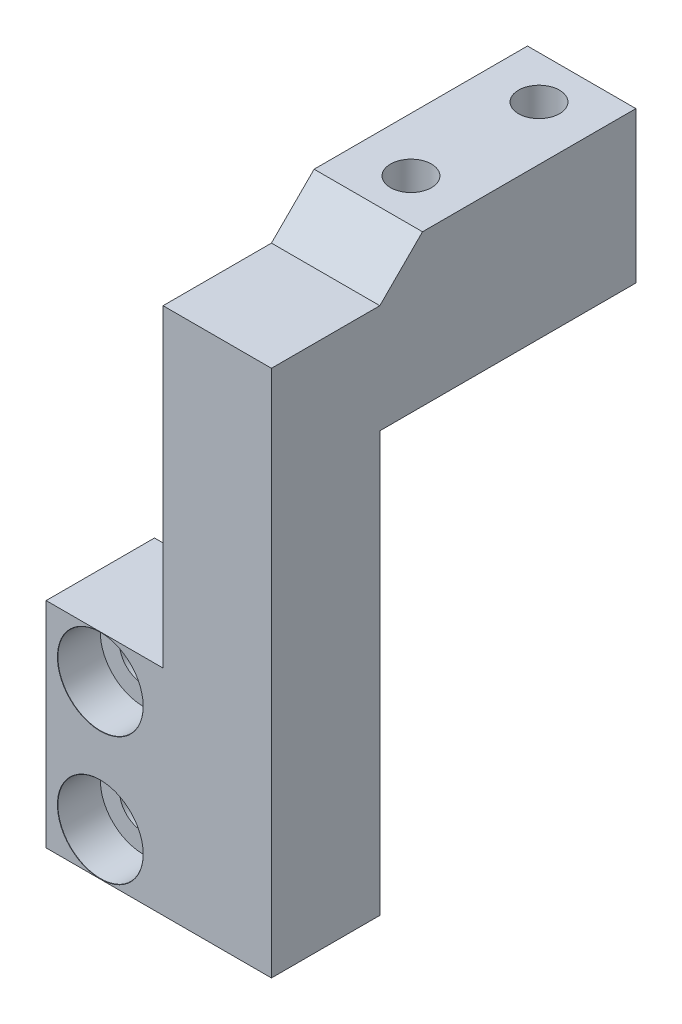
ISO-10303-21;
HEADER;
FILE_DESCRIPTION(('STEP AP214'),'2;1');
FILE_NAME('part.step','',(''),(''),'','','');
FILE_SCHEMA(('AUTOMOTIVE_DESIGN { 1 0 10303 214 1 1 1 1 }'));
ENDSEC;
DATA;
#1=APPLICATION_CONTEXT('core data for automotive mechanical design processes');
#2=APPLICATION_PROTOCOL_DEFINITION('international standard','automotive_design',2000,#1);
#3=PRODUCT_CONTEXT('',#1,'mechanical');
#4=PRODUCT('Part','Part','',(#3));
#5=PRODUCT_RELATED_PRODUCT_CATEGORY('part','',(#4));
#6=PRODUCT_DEFINITION_FORMATION('','',#4);
#7=PRODUCT_DEFINITION_CONTEXT('part definition',#1,'design');
#8=PRODUCT_DEFINITION('design','',#6,#7);
#9=PRODUCT_DEFINITION_SHAPE('','',#8);
#10=(LENGTH_UNIT() NAMED_UNIT(*) SI_UNIT(.MILLI.,.METRE.));
#11=(NAMED_UNIT(*) PLANE_ANGLE_UNIT() SI_UNIT($,.RADIAN.));
#12=(NAMED_UNIT(*) SI_UNIT($,.STERADIAN.) SOLID_ANGLE_UNIT());
#13=UNCERTAINTY_MEASURE_WITH_UNIT(LENGTH_MEASURE(1.E-05),#10,'distance_accuracy_value','');
#14=(GEOMETRIC_REPRESENTATION_CONTEXT(3) GLOBAL_UNCERTAINTY_ASSIGNED_CONTEXT((#13)) GLOBAL_UNIT_ASSIGNED_CONTEXT((#10,
#11,#12)) REPRESENTATION_CONTEXT('',''));
#15=CARTESIAN_POINT('',(0.,0.,0.));
#16=DIRECTION('',(0.,0.,1.));
#17=DIRECTION('',(1.,0.,0.));
#18=AXIS2_PLACEMENT_3D('',#15,#16,#17);
#19=CARTESIAN_POINT('',(0.,12.7,0.));
#20=DIRECTION('',(0.,-1.,0.));
#21=DIRECTION('',(0.,0.,-1.));
#22=AXIS2_PLACEMENT_3D('',#19,#20,#21);
#23=PLANE('',#22);
#24=DIRECTION('',(0.,0.,1.));
#25=VECTOR('',#24,1.);
#26=CARTESIAN_POINT('',(-6.35,12.7,42.));
#27=LINE('',#26,#25);
#28=CARTESIAN_POINT('',(-6.35,12.7,-12.));
#29=VERTEX_POINT('',#28);
#30=CARTESIAN_POINT('',(-6.35,12.7,0.700000000000013));
#31=VERTEX_POINT('',#30);
#32=EDGE_CURVE('E254',#29,#31,#27,.T.);
#33=ORIENTED_EDGE('',*,*,#32,.T.);
#34=DIRECTION('',(1.,0.,0.));
#35=VECTOR('',#34,1.);
#36=CARTESIAN_POINT('',(-6.35,12.7,0.700000000000013));
#37=LINE('',#36,#35);
#38=CARTESIAN_POINT('',(6.35,12.7,0.700000000000013));
#39=VERTEX_POINT('',#38);
#40=EDGE_CURVE('E188',#31,#39,#37,.T.);
#41=ORIENTED_EDGE('',*,*,#40,.T.);
#42=DIRECTION('',(0.,0.,-1.));
#43=VECTOR('',#42,1.);
#44=CARTESIAN_POINT('',(6.35,12.7,42.));
#45=LINE('',#44,#43);
#46=CARTESIAN_POINT('',(6.35,12.7,-12.));
#47=VERTEX_POINT('',#46);
#48=EDGE_CURVE('E251',#39,#47,#45,.T.);
#49=ORIENTED_EDGE('',*,*,#48,.T.);
#50=DIRECTION('',(-1.,0.,0.));
#51=VECTOR('',#50,1.);
#52=CARTESIAN_POINT('',(-6.35,12.7,-12.));
#53=LINE('',#52,#51);
#54=EDGE_CURVE('E275',#47,#29,#53,.T.);
#55=ORIENTED_EDGE('',*,*,#54,.T.);
#56=EDGE_LOOP('',(#33,#41,#49,#55));
#57=FACE_BOUND('',#56,.T.);
#58=ADVANCED_FACE('F45',(#57),#23,.F.);
#59=CARTESIAN_POINT('',(6.35,12.7,42.));
#60=DIRECTION('',(-1.,0.,0.));
#61=DIRECTION('',(0.,0.,1.));
#62=AXIS2_PLACEMENT_3D('',#59,#60,#61);
#63=PLANE('',#62);
#64=ORIENTED_EDGE('',*,*,#48,.F.);
#65=DIRECTION('',(0.,1.,0.));
#66=VECTOR('',#65,1.);
#67=CARTESIAN_POINT('',(6.35,12.7,0.700000000000013));
#68=LINE('',#67,#66);
#69=CARTESIAN_POINT('',(6.35,-49.17,0.700000000000021));
#70=VERTEX_POINT('',#69);
#71=EDGE_CURVE('E184',#70,#39,#68,.T.);
#72=ORIENTED_EDGE('',*,*,#71,.F.);
#73=DIRECTION('',(0.,0.,1.));
#74=VECTOR('',#73,1.);
#75=CARTESIAN_POINT('',(6.35,-49.17,0.700000000000021));
#76=LINE('',#75,#74);
#77=CARTESIAN_POINT('',(6.35,-49.17,-12.));
#78=VERTEX_POINT('',#77);
#79=EDGE_CURVE('E133',#78,#70,#76,.T.);
#80=ORIENTED_EDGE('',*,*,#79,.F.);
#81=DIRECTION('',(0.,1.,0.));
#82=VECTOR('',#81,1.);
#83=CARTESIAN_POINT('',(6.35,-49.17,-12.));
#84=LINE('',#83,#82);
#85=CARTESIAN_POINT('',(6.35,0.,-12.));
#86=VERTEX_POINT('',#85);
#87=EDGE_CURVE('E137',#78,#86,#84,.T.);
#88=ORIENTED_EDGE('',*,*,#87,.T.);
#89=DIRECTION('',(0.,0.,-1.));
#90=VECTOR('',#89,1.);
#91=CARTESIAN_POINT('',(6.35,0.,42.));
#92=LINE('',#91,#90);
#93=CARTESIAN_POINT('',(6.35,0.,-42.));
#94=VERTEX_POINT('',#93);
#95=EDGE_CURVE('E250',#86,#94,#92,.T.);
#96=ORIENTED_EDGE('',*,*,#95,.T.);
#97=DIRECTION('',(0.,-1.,0.));
#98=VECTOR('',#97,1.);
#99=CARTESIAN_POINT('',(6.35,12.7,-42.));
#100=LINE('',#99,#98);
#101=CARTESIAN_POINT('',(6.34999999999994,17.7,-42.));
#102=VERTEX_POINT('',#101);
#103=EDGE_CURVE('E271',#102,#94,#100,.T.);
#104=ORIENTED_EDGE('',*,*,#103,.F.);
#105=DIRECTION('',(0.,0.,-1.));
#106=VECTOR('',#105,1.);
#107=CARTESIAN_POINT('',(6.34999999999994,17.7,-42.));
#108=LINE('',#107,#106);
#109=CARTESIAN_POINT('',(6.35000000000006,17.7,-17.));
#110=VERTEX_POINT('',#109);
#111=EDGE_CURVE('E242',#110,#102,#108,.T.);
#112=ORIENTED_EDGE('',*,*,#111,.F.);
#113=DIRECTION('',(0.,0.70710678118655,-0.707106781186545));
#114=VECTOR('',#113,1.);
#115=CARTESIAN_POINT('',(6.35,-14.3,14.9999999999998));
#116=LINE('',#115,#114);
#117=EDGE_CURVE('E56',#110,#47,#116,.F.);
#118=ORIENTED_EDGE('',*,*,#117,.T.);
#119=EDGE_LOOP('',(#64,#72,#80,#88,#96,#104,#112,#118));
#120=FACE_BOUND('',#119,.T.);
#121=ADVANCED_FACE('F345',(#120),#63,.F.);
#122=CARTESIAN_POINT('',(-6.35,12.7,-42.));
#123=DIRECTION('',(0.,0.,1.));
#124=DIRECTION('',(1.,0.,0.));
#125=AXIS2_PLACEMENT_3D('',#122,#123,#124);
#126=PLANE('',#125);
#127=DIRECTION('',(-1.,0.,0.));
#128=VECTOR('',#127,1.);
#129=CARTESIAN_POINT('',(-6.35,0.,-42.));
#130=LINE('',#129,#128);
#131=CARTESIAN_POINT('',(-6.35,0.,-42.));
#132=VERTEX_POINT('',#131);
#133=EDGE_CURVE('E262',#94,#132,#130,.T.);
#134=ORIENTED_EDGE('',*,*,#133,.T.);
#135=DIRECTION('',(0.,-1.,0.));
#136=VECTOR('',#135,1.);
#137=CARTESIAN_POINT('',(-6.35,12.7,-42.));
#138=LINE('',#137,#136);
#139=CARTESIAN_POINT('',(-6.34999999999994,17.7,-42.));
#140=VERTEX_POINT('',#139);
#141=EDGE_CURVE('E259',#140,#132,#138,.T.);
#142=ORIENTED_EDGE('',*,*,#141,.F.);
#143=DIRECTION('',(-1.,0.,0.));
#144=VECTOR('',#143,1.);
#145=CARTESIAN_POINT('',(-6.34999999999994,17.7,-42.));
#146=LINE('',#145,#144);
#147=EDGE_CURVE('E246',#102,#140,#146,.T.);
#148=ORIENTED_EDGE('',*,*,#147,.F.);
#149=ORIENTED_EDGE('',*,*,#103,.T.);
#150=EDGE_LOOP('',(#134,#142,#148,#149));
#151=FACE_BOUND('',#150,.T.);
#152=ADVANCED_FACE('F351',(#151),#126,.F.);
#153=CARTESIAN_POINT('',(-6.35,12.7,42.));
#154=DIRECTION('',(1.,0.,0.));
#155=DIRECTION('',(0.,0.,-1.));
#156=AXIS2_PLACEMENT_3D('',#153,#154,#155);
#157=PLANE('',#156);
#158=DIRECTION('',(0.,1.,0.));
#159=VECTOR('',#158,1.);
#160=CARTESIAN_POINT('',(-6.35,-49.17,-12.));
#161=LINE('',#160,#159);
#162=CARTESIAN_POINT('',(-6.35,-24.07,-12.));
#163=VERTEX_POINT('',#162);
#164=CARTESIAN_POINT('',(-6.35,0.,-12.));
#165=VERTEX_POINT('',#164);
#166=EDGE_CURVE('E72',#163,#165,#161,.T.);
#167=ORIENTED_EDGE('',*,*,#166,.F.);
#168=DIRECTION('',(0.,0.,1.));
#169=VECTOR('',#168,1.);
#170=CARTESIAN_POINT('',(-6.35,-24.07,0.700000000000021));
#171=LINE('',#170,#169);
#172=CARTESIAN_POINT('',(-6.35,-24.07,0.699999999999993));
#173=VERTEX_POINT('',#172);
#174=EDGE_CURVE('E152',#163,#173,#171,.T.);
#175=ORIENTED_EDGE('',*,*,#174,.T.);
#176=DIRECTION('',(0.,1.,0.));
#177=VECTOR('',#176,1.);
#178=CARTESIAN_POINT('',(-6.35,12.7,0.700000000000013));
#179=LINE('',#178,#177);
#180=EDGE_CURVE('E185',#173,#31,#179,.T.);
#181=ORIENTED_EDGE('',*,*,#180,.T.);
#182=ORIENTED_EDGE('',*,*,#32,.F.);
#183=DIRECTION('',(0.,-0.70710678118655,0.707106781186545));
#184=VECTOR('',#183,1.);
#185=CARTESIAN_POINT('',(-6.35,-14.3,14.9999999999998));
#186=LINE('',#185,#184);
#187=CARTESIAN_POINT('',(-6.34999999999994,17.7,-17.));
#188=VERTEX_POINT('',#187);
#189=EDGE_CURVE('E11',#29,#188,#186,.F.);
#190=ORIENTED_EDGE('',*,*,#189,.T.);
#191=DIRECTION('',(0.,0.,1.));
#192=VECTOR('',#191,1.);
#193=CARTESIAN_POINT('',(-6.34999999999994,17.7,-42.));
#194=LINE('',#193,#192);
#195=EDGE_CURVE('E234',#140,#188,#194,.T.);
#196=ORIENTED_EDGE('',*,*,#195,.F.);
#197=ORIENTED_EDGE('',*,*,#141,.T.);
#198=DIRECTION('',(0.,0.,1.));
#199=VECTOR('',#198,1.);
#200=CARTESIAN_POINT('',(-6.35,0.,42.));
#201=LINE('',#200,#199);
#202=EDGE_CURVE('E255',#132,#165,#201,.T.);
#203=ORIENTED_EDGE('',*,*,#202,.T.);
#204=EDGE_LOOP('',(#167,#175,#181,#182,#190,#196,#197,#203));
#205=FACE_BOUND('',#204,.T.);
#206=ADVANCED_FACE('F360',(#205),#157,.F.);
#207=CARTESIAN_POINT('',(0.,0.,0.));
#208=DIRECTION('',(0.,-1.,0.));
#209=DIRECTION('',(0.,0.,-1.));
#210=AXIS2_PLACEMENT_3D('',#207,#208,#209);
#211=PLANE('',#210);
#212=DIRECTION('',(1.,0.,0.));
#213=VECTOR('',#212,1.);
#214=CARTESIAN_POINT('',(-6.35,0.,-12.));
#215=LINE('',#214,#213);
#216=EDGE_CURVE('E169',#165,#86,#215,.T.);
#217=ORIENTED_EDGE('',*,*,#216,.F.);
#218=ORIENTED_EDGE('',*,*,#202,.F.);
#219=ORIENTED_EDGE('',*,*,#133,.F.);
#220=ORIENTED_EDGE('',*,*,#95,.F.);
#221=EDGE_LOOP('',(#217,#218,#219,#220));
#222=FACE_BOUND('',#221,.T.);
#223=CARTESIAN_POINT('',(0.,0.,-37.));
#224=DIRECTION('',(0.,-1.,0.));
#225=DIRECTION('',(0.,0.,-1.));
#226=AXIS2_PLACEMENT_3D('',#223,#224,#225);
#227=CIRCLE('',#226,4.025);
#228=CARTESIAN_POINT('',(0.,0.,-41.025));
#229=VERTEX_POINT('',#228);
#230=EDGE_CURVE('E194',#229,#229,#227,.T.);
#231=ORIENTED_EDGE('',*,*,#230,.F.);
#232=EDGE_LOOP('',(#231));
#233=FACE_BOUND('',#232,.T.);
#234=CARTESIAN_POINT('',(0.,0.,-22.));
#235=DIRECTION('',(0.,-1.,0.));
#236=DIRECTION('',(0.,0.,-1.));
#237=AXIS2_PLACEMENT_3D('',#234,#235,#236);
#238=CIRCLE('',#237,4.025);
#239=CARTESIAN_POINT('',(0.,0.,-26.025));
#240=VERTEX_POINT('',#239);
#241=EDGE_CURVE('E214',#240,#240,#238,.T.);
#242=ORIENTED_EDGE('',*,*,#241,.F.);
#243=EDGE_LOOP('',(#242));
#244=FACE_BOUND('',#243,.T.);
#245=ADVANCED_FACE('F357',(#222,#233,#244),#211,.T.);
#246=CARTESIAN_POINT('',(0.,17.7,0.));
#247=DIRECTION('',(0.,1.,0.));
#248=DIRECTION('',(0.,0.,1.));
#249=AXIS2_PLACEMENT_3D('',#246,#247,#248);
#250=PLANE('',#249);
#251=CARTESIAN_POINT('',(0.,17.7,-37.));
#252=DIRECTION('',(0.,-1.,0.));
#253=DIRECTION('',(0.,0.,-1.));
#254=AXIS2_PLACEMENT_3D('',#251,#252,#253);
#255=CIRCLE('',#254,2.4);
#256=CARTESIAN_POINT('',(0.,17.7,-39.4));
#257=VERTEX_POINT('',#256);
#258=EDGE_CURVE('E210',#257,#257,#255,.T.);
#259=ORIENTED_EDGE('',*,*,#258,.T.);
#260=EDGE_LOOP('',(#259));
#261=FACE_BOUND('',#260,.T.);
#262=CARTESIAN_POINT('',(0.,17.7,-22.));
#263=DIRECTION('',(0.,-1.,0.));
#264=DIRECTION('',(0.,0.,-1.));
#265=AXIS2_PLACEMENT_3D('',#262,#263,#264);
#266=CIRCLE('',#265,2.4);
#267=CARTESIAN_POINT('',(0.,17.7,-24.4));
#268=VERTEX_POINT('',#267);
#269=EDGE_CURVE('E230',#268,#268,#266,.T.);
#270=ORIENTED_EDGE('',*,*,#269,.T.);
#271=EDGE_LOOP('',(#270));
#272=FACE_BOUND('',#271,.T.);
#273=ORIENTED_EDGE('',*,*,#195,.T.);
#274=DIRECTION('',(1.,0.,0.));
#275=VECTOR('',#274,1.);
#276=CARTESIAN_POINT('',(-6.34999999999994,17.7,-17.));
#277=LINE('',#276,#275);
#278=EDGE_CURVE('E238',#188,#110,#277,.T.);
#279=ORIENTED_EDGE('',*,*,#278,.T.);
#280=ORIENTED_EDGE('',*,*,#111,.T.);
#281=ORIENTED_EDGE('',*,*,#147,.T.);
#282=EDGE_LOOP('',(#273,#279,#280,#281));
#283=FACE_BOUND('',#282,.T.);
#284=ADVANCED_FACE('F355',(#261,#272,#283),#250,.T.);
#285=CARTESIAN_POINT('',(0.,0.,-22.));
#286=DIRECTION('',(0.,-1.,0.));
#287=DIRECTION('',(0.,0.,-1.));
#288=AXIS2_PLACEMENT_3D('',#285,#286,#287);
#289=CYLINDRICAL_SURFACE('',#288,2.4);
#290=ORIENTED_EDGE('',*,*,#269,.F.);
#291=EDGE_LOOP('',(#290));
#292=FACE_BOUND('',#291,.T.);
#293=CARTESIAN_POINT('',(0.,4.,-22.));
#294=DIRECTION('',(0.,-1.,0.));
#295=DIRECTION('',(0.,0.,-1.));
#296=AXIS2_PLACEMENT_3D('',#293,#294,#295);
#297=CIRCLE('',#296,2.4);
#298=CARTESIAN_POINT('',(0.,4.,-24.4));
#299=VERTEX_POINT('',#298);
#300=EDGE_CURVE('E226',#299,#299,#297,.T.);
#301=ORIENTED_EDGE('',*,*,#300,.T.);
#302=EDGE_LOOP('',(#301));
#303=FACE_BOUND('',#302,.T.);
#304=ADVANCED_FACE('F385',(#292,#303),#289,.F.);
#305=CARTESIAN_POINT('',(4.,4.,-22.));
#306=DIRECTION('',(0.,1.,0.));
#307=DIRECTION('',(0.,0.,1.));
#308=AXIS2_PLACEMENT_3D('',#305,#306,#307);
#309=PLANE('',#308);
#310=ORIENTED_EDGE('',*,*,#300,.F.);
#311=EDGE_LOOP('',(#310));
#312=FACE_BOUND('',#311,.T.);
#313=CARTESIAN_POINT('',(0.,4.,-22.));
#314=DIRECTION('',(0.,-1.,0.));
#315=DIRECTION('',(0.,0.,-1.));
#316=AXIS2_PLACEMENT_3D('',#313,#314,#315);
#317=CIRCLE('',#316,4.);
#318=CARTESIAN_POINT('',(0.,4.,-26.));
#319=VERTEX_POINT('',#318);
#320=EDGE_CURVE('E222',#319,#319,#317,.T.);
#321=ORIENTED_EDGE('',*,*,#320,.T.);
#322=EDGE_LOOP('',(#321));
#323=FACE_BOUND('',#322,.T.);
#324=ADVANCED_FACE('F390',(#312,#323),#309,.F.);
#325=CARTESIAN_POINT('',(0.,0.,-22.));
#326=DIRECTION('',(0.,-1.,0.));
#327=DIRECTION('',(0.,0.,-1.));
#328=AXIS2_PLACEMENT_3D('',#325,#326,#327);
#329=CYLINDRICAL_SURFACE('',#328,4.);
#330=ORIENTED_EDGE('',*,*,#320,.F.);
#331=EDGE_LOOP('',(#330));
#332=FACE_BOUND('',#331,.T.);
#333=CARTESIAN_POINT('',(0.,0.0209774907794339,-22.));
#334=DIRECTION('',(0.,-1.,0.));
#335=DIRECTION('',(0.,0.,-1.));
#336=AXIS2_PLACEMENT_3D('',#333,#334,#335);
#337=CIRCLE('',#336,4.);
#338=CARTESIAN_POINT('',(0.,0.0209774907794339,-26.));
#339=VERTEX_POINT('',#338);
#340=EDGE_CURVE('E218',#339,#339,#337,.T.);
#341=ORIENTED_EDGE('',*,*,#340,.T.);
#342=EDGE_LOOP('',(#341));
#343=FACE_BOUND('',#342,.T.);
#344=ADVANCED_FACE('F400',(#332,#343),#329,.F.);
#345=CARTESIAN_POINT('',(0.,0.,-22.));
#346=DIRECTION('',(0.,-1.,0.));
#347=DIRECTION('',(0.,0.,-1.));
#348=AXIS2_PLACEMENT_3D('',#345,#346,#347);
#349=CONICAL_SURFACE('',#348,4.025,0.872664625997167);
#350=ORIENTED_EDGE('',*,*,#340,.F.);
#351=EDGE_LOOP('',(#350));
#352=FACE_BOUND('',#351,.T.);
#353=ORIENTED_EDGE('',*,*,#241,.T.);
#354=EDGE_LOOP('',(#353));
#355=FACE_BOUND('',#354,.T.);
#356=ADVANCED_FACE('F406',(#352,#355),#349,.F.);
#357=CARTESIAN_POINT('',(0.,0.,-37.));
#358=DIRECTION('',(0.,-1.,0.));
#359=DIRECTION('',(0.,0.,-1.));
#360=AXIS2_PLACEMENT_3D('',#357,#358,#359);
#361=CYLINDRICAL_SURFACE('',#360,2.4);
#362=ORIENTED_EDGE('',*,*,#258,.F.);
#363=EDGE_LOOP('',(#362));
#364=FACE_BOUND('',#363,.T.);
#365=CARTESIAN_POINT('',(0.,4.,-37.));
#366=DIRECTION('',(0.,-1.,0.));
#367=DIRECTION('',(0.,0.,-1.));
#368=AXIS2_PLACEMENT_3D('',#365,#366,#367);
#369=CIRCLE('',#368,2.4);
#370=CARTESIAN_POINT('',(0.,4.,-39.4));
#371=VERTEX_POINT('',#370);
#372=EDGE_CURVE('E206',#371,#371,#369,.T.);
#373=ORIENTED_EDGE('',*,*,#372,.T.);
#374=EDGE_LOOP('',(#373));
#375=FACE_BOUND('',#374,.T.);
#376=ADVANCED_FACE('F412',(#364,#375),#361,.F.);
#377=CARTESIAN_POINT('',(4.,4.,-37.));
#378=DIRECTION('',(0.,1.,0.));
#379=DIRECTION('',(0.,0.,1.));
#380=AXIS2_PLACEMENT_3D('',#377,#378,#379);
#381=PLANE('',#380);
#382=ORIENTED_EDGE('',*,*,#372,.F.);
#383=EDGE_LOOP('',(#382));
#384=FACE_BOUND('',#383,.T.);
#385=CARTESIAN_POINT('',(0.,4.,-37.));
#386=DIRECTION('',(0.,-1.,0.));
#387=DIRECTION('',(0.,0.,-1.));
#388=AXIS2_PLACEMENT_3D('',#385,#386,#387);
#389=CIRCLE('',#388,4.);
#390=CARTESIAN_POINT('',(0.,4.,-41.));
#391=VERTEX_POINT('',#390);
#392=EDGE_CURVE('E202',#391,#391,#389,.T.);
#393=ORIENTED_EDGE('',*,*,#392,.T.);
#394=EDGE_LOOP('',(#393));
#395=FACE_BOUND('',#394,.T.);
#396=ADVANCED_FACE('F419',(#384,#395),#381,.F.);
#397=CARTESIAN_POINT('',(0.,0.,-37.));
#398=DIRECTION('',(0.,-1.,0.));
#399=DIRECTION('',(0.,0.,-1.));
#400=AXIS2_PLACEMENT_3D('',#397,#398,#399);
#401=CYLINDRICAL_SURFACE('',#400,4.);
#402=ORIENTED_EDGE('',*,*,#392,.F.);
#403=EDGE_LOOP('',(#402));
#404=FACE_BOUND('',#403,.T.);
#405=CARTESIAN_POINT('',(0.,0.0209774907794339,-37.));
#406=DIRECTION('',(0.,-1.,0.));
#407=DIRECTION('',(0.,0.,-1.));
#408=AXIS2_PLACEMENT_3D('',#405,#406,#407);
#409=CIRCLE('',#408,4.);
#410=CARTESIAN_POINT('',(0.,0.0209774907794339,-41.));
#411=VERTEX_POINT('',#410);
#412=EDGE_CURVE('E198',#411,#411,#409,.T.);
#413=ORIENTED_EDGE('',*,*,#412,.T.);
#414=EDGE_LOOP('',(#413));
#415=FACE_BOUND('',#414,.T.);
#416=ADVANCED_FACE('F425',(#404,#415),#401,.F.);
#417=CARTESIAN_POINT('',(0.,0.,-37.));
#418=DIRECTION('',(0.,-1.,0.));
#419=DIRECTION('',(0.,0.,-1.));
#420=AXIS2_PLACEMENT_3D('',#417,#418,#419);
#421=CONICAL_SURFACE('',#420,4.025,0.872664625997167);
#422=ORIENTED_EDGE('',*,*,#412,.F.);
#423=EDGE_LOOP('',(#422));
#424=FACE_BOUND('',#423,.T.);
#425=ORIENTED_EDGE('',*,*,#230,.T.);
#426=EDGE_LOOP('',(#425));
#427=FACE_BOUND('',#426,.T.);
#428=ADVANCED_FACE('F429',(#424,#427),#421,.F.);
#429=CARTESIAN_POINT('',(-6.34999999999994,17.7,-17.));
#430=DIRECTION('',(0.,0.707106781186545,0.707106781186551));
#431=DIRECTION('',(-1.,0.,0.));
#432=AXIS2_PLACEMENT_3D('',#429,#430,#431);
#433=PLANE('',#432);
#434=ORIENTED_EDGE('',*,*,#189,.F.);
#435=ORIENTED_EDGE('',*,*,#54,.F.);
#436=ORIENTED_EDGE('',*,*,#117,.F.);
#437=ORIENTED_EDGE('',*,*,#278,.F.);
#438=EDGE_LOOP('',(#434,#435,#436,#437));
#439=FACE_BOUND('',#438,.T.);
#440=ADVANCED_FACE('F48',(#439),#433,.T.);
#441=CARTESIAN_POINT('',(-6.35,12.7,0.700000000000013));
#442=DIRECTION('',(0.,0.,-1.));
#443=DIRECTION('',(0.,1.,0.));
#444=AXIS2_PLACEMENT_3D('',#441,#442,#443);
#445=PLANE('',#444);
#446=CARTESIAN_POINT('',(-13.7,-29.12,0.700000000000006));
#447=DIRECTION('',(0.,0.,1.));
#448=DIRECTION('',(1.,0.,0.));
#449=AXIS2_PLACEMENT_3D('',#446,#447,#448);
#450=CIRCLE('',#449,5.025);
#451=CARTESIAN_POINT('',(-8.675,-29.12,0.700000000000006));
#452=VERTEX_POINT('',#451);
#453=EDGE_CURVE('E314',#452,#452,#450,.T.);
#454=ORIENTED_EDGE('',*,*,#453,.F.);
#455=EDGE_LOOP('',(#454));
#456=FACE_BOUND('',#455,.T.);
#457=CARTESIAN_POINT('',(-13.7,-44.12,0.700000000000006));
#458=DIRECTION('',(0.,0.,1.));
#459=DIRECTION('',(1.,0.,0.));
#460=AXIS2_PLACEMENT_3D('',#457,#458,#459);
#461=CIRCLE('',#460,5.025);
#462=CARTESIAN_POINT('',(-8.675,-44.12,0.700000000000006));
#463=VERTEX_POINT('',#462);
#464=EDGE_CURVE('E296',#463,#463,#461,.T.);
#465=ORIENTED_EDGE('',*,*,#464,.F.);
#466=EDGE_LOOP('',(#465));
#467=FACE_BOUND('',#466,.T.);
#468=ORIENTED_EDGE('',*,*,#71,.T.);
#469=ORIENTED_EDGE('',*,*,#40,.F.);
#470=ORIENTED_EDGE('',*,*,#180,.F.);
#471=DIRECTION('',(1.,0.,0.));
#472=VECTOR('',#471,1.);
#473=CARTESIAN_POINT('',(-20.05,-24.07,0.700000000000021));
#474=LINE('',#473,#472);
#475=CARTESIAN_POINT('',(-20.05,-24.07,0.700000000000021));
#476=VERTEX_POINT('',#475);
#477=EDGE_CURVE('E64',#476,#173,#474,.T.);
#478=ORIENTED_EDGE('',*,*,#477,.F.);
#479=DIRECTION('',(0.,-1.,0.));
#480=VECTOR('',#479,1.);
#481=CARTESIAN_POINT('',(-20.05,-49.17,0.700000000000021));
#482=LINE('',#481,#480);
#483=CARTESIAN_POINT('',(-20.05,-49.17,0.700000000000021));
#484=VERTEX_POINT('',#483);
#485=EDGE_CURVE('E144',#476,#484,#482,.T.);
#486=ORIENTED_EDGE('',*,*,#485,.T.);
#487=DIRECTION('',(-1.,0.,0.));
#488=VECTOR('',#487,1.);
#489=CARTESIAN_POINT('',(-6.35,-49.17,0.70000000000002));
#490=LINE('',#489,#488);
#491=EDGE_CURVE('E128',#70,#484,#490,.T.);
#492=ORIENTED_EDGE('',*,*,#491,.F.);
#493=EDGE_LOOP('',(#468,#469,#470,#478,#486,#492));
#494=FACE_BOUND('',#493,.T.);
#495=ADVANCED_FACE('F149',(#456,#467,#494),#445,.F.);
#496=CARTESIAN_POINT('',(-6.35,-49.17,-12.));
#497=DIRECTION('',(0.,0.,1.));
#498=DIRECTION('',(1.,0.,0.));
#499=AXIS2_PLACEMENT_3D('',#496,#497,#498);
#500=PLANE('',#499);
#501=CARTESIAN_POINT('',(-13.7,-29.12,-12.));
#502=DIRECTION('',(0.,0.,1.));
#503=DIRECTION('',(1.,0.,0.));
#504=AXIS2_PLACEMENT_3D('',#501,#502,#503);
#505=CIRCLE('',#504,2.74999999999999);
#506=CARTESIAN_POINT('',(-10.95,-29.12,-12.));
#507=VERTEX_POINT('',#506);
#508=EDGE_CURVE('E50',#507,#507,#505,.T.);
#509=ORIENTED_EDGE('',*,*,#508,.T.);
#510=EDGE_LOOP('',(#509));
#511=FACE_BOUND('',#510,.T.);
#512=CARTESIAN_POINT('',(-13.7,-44.12,-12.));
#513=DIRECTION('',(0.,0.,1.));
#514=DIRECTION('',(1.,0.,0.));
#515=AXIS2_PLACEMENT_3D('',#512,#513,#514);
#516=CIRCLE('',#515,2.74999999999999);
#517=CARTESIAN_POINT('',(-10.95,-44.12,-12.));
#518=VERTEX_POINT('',#517);
#519=EDGE_CURVE('E155',#518,#518,#516,.T.);
#520=ORIENTED_EDGE('',*,*,#519,.T.);
#521=EDGE_LOOP('',(#520));
#522=FACE_BOUND('',#521,.T.);
#523=ORIENTED_EDGE('',*,*,#216,.T.);
#524=ORIENTED_EDGE('',*,*,#87,.F.);
#525=DIRECTION('',(1.,0.,0.));
#526=VECTOR('',#525,1.);
#527=CARTESIAN_POINT('',(-6.35,-49.17,-12.));
#528=LINE('',#527,#526);
#529=CARTESIAN_POINT('',(-20.05,-49.17,-12.));
#530=VERTEX_POINT('',#529);
#531=EDGE_CURVE('E172',#530,#78,#528,.T.);
#532=ORIENTED_EDGE('',*,*,#531,.F.);
#533=DIRECTION('',(0.,1.,0.));
#534=VECTOR('',#533,1.);
#535=CARTESIAN_POINT('',(-20.05,-49.17,-12.));
#536=LINE('',#535,#534);
#537=CARTESIAN_POINT('',(-20.05,-24.07,-12.));
#538=VERTEX_POINT('',#537);
#539=EDGE_CURVE('E146',#530,#538,#536,.T.);
#540=ORIENTED_EDGE('',*,*,#539,.T.);
#541=DIRECTION('',(1.,0.,0.));
#542=VECTOR('',#541,1.);
#543=CARTESIAN_POINT('',(-20.05,-24.07,-12.));
#544=LINE('',#543,#542);
#545=EDGE_CURVE('E165',#538,#163,#544,.T.);
#546=ORIENTED_EDGE('',*,*,#545,.T.);
#547=ORIENTED_EDGE('',*,*,#166,.T.);
#548=EDGE_LOOP('',(#523,#524,#532,#540,#546,#547));
#549=FACE_BOUND('',#548,.T.);
#550=ADVANCED_FACE('F323',(#511,#522,#549),#500,.F.);
#551=CARTESIAN_POINT('',(0.,-49.17,0.));
#552=DIRECTION('',(0.,-1.,0.));
#553=DIRECTION('',(0.,0.,-1.));
#554=AXIS2_PLACEMENT_3D('',#551,#552,#553);
#555=PLANE('',#554);
#556=ORIENTED_EDGE('',*,*,#491,.T.);
#557=DIRECTION('',(0.,0.,-1.));
#558=VECTOR('',#557,1.);
#559=CARTESIAN_POINT('',(-20.05,-49.17,0.700000000000021));
#560=LINE('',#559,#558);
#561=EDGE_CURVE('E131',#484,#530,#560,.T.);
#562=ORIENTED_EDGE('',*,*,#561,.T.);
#563=ORIENTED_EDGE('',*,*,#531,.T.);
#564=ORIENTED_EDGE('',*,*,#79,.T.);
#565=EDGE_LOOP('',(#556,#562,#563,#564));
#566=FACE_BOUND('',#565,.T.);
#567=ADVANCED_FACE('F130',(#566),#555,.T.);
#568=CARTESIAN_POINT('',(-20.05,-24.07,0.700000000000021));
#569=DIRECTION('',(0.,1.,0.));
#570=DIRECTION('',(0.,0.,1.));
#571=AXIS2_PLACEMENT_3D('',#568,#569,#570);
#572=PLANE('',#571);
#573=ORIENTED_EDGE('',*,*,#174,.F.);
#574=ORIENTED_EDGE('',*,*,#545,.F.);
#575=DIRECTION('',(0.,0.,1.));
#576=VECTOR('',#575,1.);
#577=CARTESIAN_POINT('',(-20.05,-24.07,0.700000000000021));
#578=LINE('',#577,#576);
#579=EDGE_CURVE('E163',#538,#476,#578,.T.);
#580=ORIENTED_EDGE('',*,*,#579,.T.);
#581=ORIENTED_EDGE('',*,*,#477,.T.);
#582=EDGE_LOOP('',(#573,#574,#580,#581));
#583=FACE_BOUND('',#582,.T.);
#584=ADVANCED_FACE('F439',(#583),#572,.T.);
#585=CARTESIAN_POINT('',(-20.05,0.,0.));
#586=DIRECTION('',(-1.,0.,0.));
#587=DIRECTION('',(0.,0.,1.));
#588=AXIS2_PLACEMENT_3D('',#585,#586,#587);
#589=PLANE('',#588);
#590=ORIENTED_EDGE('',*,*,#485,.F.);
#591=ORIENTED_EDGE('',*,*,#579,.F.);
#592=ORIENTED_EDGE('',*,*,#539,.F.);
#593=ORIENTED_EDGE('',*,*,#561,.F.);
#594=EDGE_LOOP('',(#590,#591,#592,#593));
#595=FACE_BOUND('',#594,.T.);
#596=ADVANCED_FACE('F142',(#595),#589,.T.);
#597=CARTESIAN_POINT('',(-13.7,-44.12,0.700000000000006));
#598=DIRECTION('',(0.,0.,1.));
#599=DIRECTION('',(1.,0.,0.));
#600=AXIS2_PLACEMENT_3D('',#597,#598,#599);
#601=CYLINDRICAL_SURFACE('',#600,2.74999999999999);
#602=CARTESIAN_POINT('',(-13.7,-44.12,-4.29999999999999));
#603=DIRECTION('',(0.,0.,1.));
#604=DIRECTION('',(1.,0.,0.));
#605=AXIS2_PLACEMENT_3D('',#602,#603,#604);
#606=CIRCLE('',#605,2.75);
#607=CARTESIAN_POINT('',(-10.95,-44.12,-4.29999999999999));
#608=VERTEX_POINT('',#607);
#609=EDGE_CURVE('E158',#608,#608,#606,.T.);
#610=ORIENTED_EDGE('',*,*,#609,.T.);
#611=EDGE_LOOP('',(#610));
#612=FACE_BOUND('',#611,.T.);
#613=ORIENTED_EDGE('',*,*,#519,.F.);
#614=EDGE_LOOP('',(#613));
#615=FACE_BOUND('',#614,.T.);
#616=ADVANCED_FACE('F444',(#612,#615),#601,.F.);
#617=CARTESIAN_POINT('',(-8.7,-44.12,-4.29999999999999));
#618=DIRECTION('',(0.,0.,-1.));
#619=DIRECTION('',(-1.,0.,0.));
#620=AXIS2_PLACEMENT_3D('',#617,#618,#619);
#621=PLANE('',#620);
#622=ORIENTED_EDGE('',*,*,#609,.F.);
#623=EDGE_LOOP('',(#622));
#624=FACE_BOUND('',#623,.T.);
#625=CARTESIAN_POINT('',(-13.7,-44.12,-4.29999999999999));
#626=DIRECTION('',(0.,0.,1.));
#627=DIRECTION('',(1.,0.,0.));
#628=AXIS2_PLACEMENT_3D('',#625,#626,#627);
#629=CIRCLE('',#628,5.);
#630=CARTESIAN_POINT('',(-8.7,-44.12,-4.29999999999999));
#631=VERTEX_POINT('',#630);
#632=EDGE_CURVE('E286',#631,#631,#629,.T.);
#633=ORIENTED_EDGE('',*,*,#632,.T.);
#634=EDGE_LOOP('',(#633));
#635=FACE_BOUND('',#634,.T.);
#636=ADVANCED_FACE('F340',(#624,#635),#621,.F.);
#637=CARTESIAN_POINT('',(-13.7,-44.12,0.700000000000006));
#638=DIRECTION('',(0.,0.,1.));
#639=DIRECTION('',(1.,0.,0.));
#640=AXIS2_PLACEMENT_3D('',#637,#638,#639);
#641=CYLINDRICAL_SURFACE('',#640,5.);
#642=ORIENTED_EDGE('',*,*,#632,.F.);
#643=EDGE_LOOP('',(#642));
#644=FACE_BOUND('',#643,.T.);
#645=CARTESIAN_POINT('',(-13.7,-44.12,0.675000000000005));
#646=DIRECTION('',(0.,0.,1.));
#647=DIRECTION('',(1.,0.,0.));
#648=AXIS2_PLACEMENT_3D('',#645,#646,#647);
#649=CIRCLE('',#648,5.);
#650=CARTESIAN_POINT('',(-8.7,-44.12,0.675000000000005));
#651=VERTEX_POINT('',#650);
#652=EDGE_CURVE('E291',#651,#651,#649,.T.);
#653=ORIENTED_EDGE('',*,*,#652,.T.);
#654=EDGE_LOOP('',(#653));
#655=FACE_BOUND('',#654,.T.);
#656=ADVANCED_FACE('F330',(#644,#655),#641,.F.);
#657=CARTESIAN_POINT('',(-13.7,-44.12,0.700000000000006));
#658=DIRECTION('',(0.,0.,1.));
#659=DIRECTION('',(1.,0.,0.));
#660=AXIS2_PLACEMENT_3D('',#657,#658,#659);
#661=CONICAL_SURFACE('',#660,5.025,0.78539816339747);
#662=ORIENTED_EDGE('',*,*,#652,.F.);
#663=EDGE_LOOP('',(#662));
#664=FACE_BOUND('',#663,.T.);
#665=ORIENTED_EDGE('',*,*,#464,.T.);
#666=EDGE_LOOP('',(#665));
#667=FACE_BOUND('',#666,.T.);
#668=ADVANCED_FACE('F327',(#664,#667),#661,.F.);
#669=CARTESIAN_POINT('',(-13.7,-29.12,0.700000000000006));
#670=DIRECTION('',(0.,0.,1.));
#671=DIRECTION('',(1.,0.,0.));
#672=AXIS2_PLACEMENT_3D('',#669,#670,#671);
#673=CYLINDRICAL_SURFACE('',#672,2.74999999999999);
#674=CARTESIAN_POINT('',(-13.7,-29.12,-4.29999999999999));
#675=DIRECTION('',(0.,0.,1.));
#676=DIRECTION('',(1.,0.,0.));
#677=AXIS2_PLACEMENT_3D('',#674,#675,#676);
#678=CIRCLE('',#677,2.75);
#679=CARTESIAN_POINT('',(-10.95,-29.12,-4.29999999999999));
#680=VERTEX_POINT('',#679);
#681=EDGE_CURVE('E302',#680,#680,#678,.T.);
#682=ORIENTED_EDGE('',*,*,#681,.T.);
#683=EDGE_LOOP('',(#682));
#684=FACE_BOUND('',#683,.T.);
#685=ORIENTED_EDGE('',*,*,#508,.F.);
#686=EDGE_LOOP('',(#685));
#687=FACE_BOUND('',#686,.T.);
#688=ADVANCED_FACE('F329',(#684,#687),#673,.F.);
#689=CARTESIAN_POINT('',(-8.7,-29.12,-4.29999999999999));
#690=DIRECTION('',(0.,0.,-1.));
#691=DIRECTION('',(-1.,0.,0.));
#692=AXIS2_PLACEMENT_3D('',#689,#690,#691);
#693=PLANE('',#692);
#694=ORIENTED_EDGE('',*,*,#681,.F.);
#695=EDGE_LOOP('',(#694));
#696=FACE_BOUND('',#695,.T.);
#697=CARTESIAN_POINT('',(-13.7,-29.12,-4.29999999999999));
#698=DIRECTION('',(0.,0.,1.));
#699=DIRECTION('',(1.,0.,0.));
#700=AXIS2_PLACEMENT_3D('',#697,#698,#699);
#701=CIRCLE('',#700,5.);
#702=CARTESIAN_POINT('',(-8.7,-29.12,-4.29999999999999));
#703=VERTEX_POINT('',#702);
#704=EDGE_CURVE('E306',#703,#703,#701,.T.);
#705=ORIENTED_EDGE('',*,*,#704,.T.);
#706=EDGE_LOOP('',(#705));
#707=FACE_BOUND('',#706,.T.);
#708=ADVANCED_FACE('F337',(#696,#707),#693,.F.);
#709=CARTESIAN_POINT('',(-13.7,-29.12,0.700000000000006));
#710=DIRECTION('',(0.,0.,1.));
#711=DIRECTION('',(1.,0.,0.));
#712=AXIS2_PLACEMENT_3D('',#709,#710,#711);
#713=CYLINDRICAL_SURFACE('',#712,5.);
#714=ORIENTED_EDGE('',*,*,#704,.F.);
#715=EDGE_LOOP('',(#714));
#716=FACE_BOUND('',#715,.T.);
#717=CARTESIAN_POINT('',(-13.7,-29.12,0.675000000000005));
#718=DIRECTION('',(0.,0.,1.));
#719=DIRECTION('',(1.,0.,0.));
#720=AXIS2_PLACEMENT_3D('',#717,#718,#719);
#721=CIRCLE('',#720,5.);
#722=CARTESIAN_POINT('',(-8.7,-29.12,0.675000000000005));
#723=VERTEX_POINT('',#722);
#724=EDGE_CURVE('E310',#723,#723,#721,.T.);
#725=ORIENTED_EDGE('',*,*,#724,.T.);
#726=EDGE_LOOP('',(#725));
#727=FACE_BOUND('',#726,.T.);
#728=ADVANCED_FACE('F479',(#716,#727),#713,.F.);
#729=CARTESIAN_POINT('',(-13.7,-29.12,0.700000000000006));
#730=DIRECTION('',(0.,0.,1.));
#731=DIRECTION('',(1.,0.,0.));
#732=AXIS2_PLACEMENT_3D('',#729,#730,#731);
#733=CONICAL_SURFACE('',#732,5.025,0.78539816339747);
#734=ORIENTED_EDGE('',*,*,#724,.F.);
#735=EDGE_LOOP('',(#734));
#736=FACE_BOUND('',#735,.T.);
#737=ORIENTED_EDGE('',*,*,#453,.T.);
#738=EDGE_LOOP('',(#737));
#739=FACE_BOUND('',#738,.T.);
#740=ADVANCED_FACE('F319',(#736,#739),#733,.F.);
#741=CLOSED_SHELL('',(#58,#121,#152,#206,#245,#284,#304,#324,#344,#356,#376,#396,#416,#428,#440,
#495,#550,#567,#584,#596,#616,#636,#656,#668,#688,#708,#728,#740));
#742=MANIFOLD_SOLID_BREP('B2',#741);
#743=ADVANCED_BREP_SHAPE_REPRESENTATION('',(#18,#742),#14);
#744=SHAPE_DEFINITION_REPRESENTATION(#9,#743);
ENDSEC;
END-ISO-10303-21;
